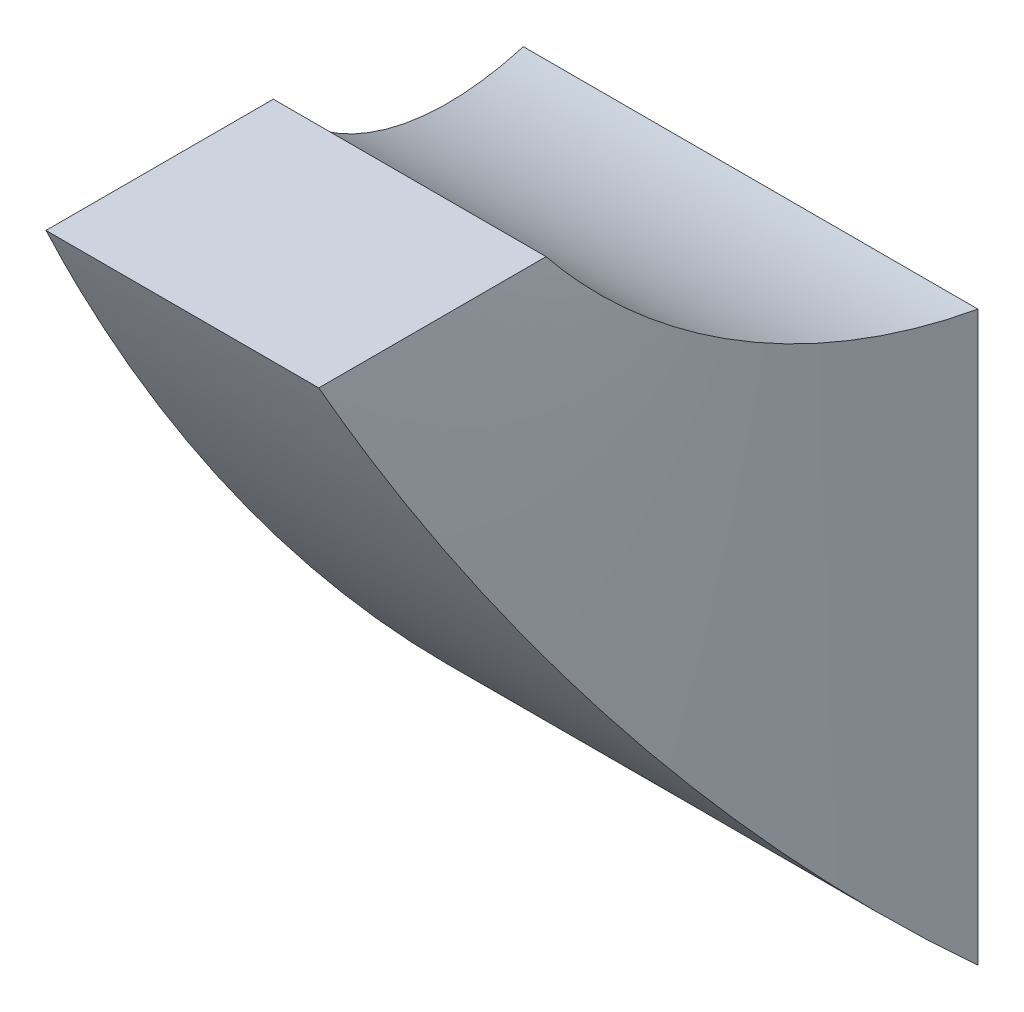
ISO-10303-21;
HEADER;
FILE_DESCRIPTION(('STEP AP214'),'2;1');
FILE_NAME('part.step','',(''),(''),'','','');
FILE_SCHEMA(('AUTOMOTIVE_DESIGN { 1 0 10303 214 1 1 1 1 }'));
ENDSEC;
DATA;
#1=APPLICATION_CONTEXT('core data for automotive mechanical design processes');
#2=APPLICATION_PROTOCOL_DEFINITION('international standard','automotive_design',2000,#1);
#3=PRODUCT_CONTEXT('',#1,'mechanical');
#4=PRODUCT('Part','Part','',(#3));
#5=PRODUCT_RELATED_PRODUCT_CATEGORY('part','',(#4));
#6=PRODUCT_DEFINITION_FORMATION('','',#4);
#7=PRODUCT_DEFINITION_CONTEXT('part definition',#1,'design');
#8=PRODUCT_DEFINITION('design','',#6,#7);
#9=PRODUCT_DEFINITION_SHAPE('','',#8);
#10=(LENGTH_UNIT() NAMED_UNIT(*) SI_UNIT(.MILLI.,.METRE.));
#11=(NAMED_UNIT(*) PLANE_ANGLE_UNIT() SI_UNIT($,.RADIAN.));
#12=(NAMED_UNIT(*) SI_UNIT($,.STERADIAN.) SOLID_ANGLE_UNIT());
#13=UNCERTAINTY_MEASURE_WITH_UNIT(LENGTH_MEASURE(1.E-05),#10,'distance_accuracy_value','');
#14=(GEOMETRIC_REPRESENTATION_CONTEXT(3) GLOBAL_UNCERTAINTY_ASSIGNED_CONTEXT((#13)) GLOBAL_UNIT_ASSIGNED_CONTEXT((#10,
#11,#12)) REPRESENTATION_CONTEXT('',''));
#15=CARTESIAN_POINT('',(0.,0.,0.));
#16=DIRECTION('',(0.,0.,1.));
#17=DIRECTION('',(1.,0.,0.));
#18=AXIS2_PLACEMENT_3D('',#15,#16,#17);
#19=CARTESIAN_POINT('',(0.,400.,0.));
#20=DIRECTION('',(0.,1.,0.));
#21=DIRECTION('',(0.,0.,1.));
#22=AXIS2_PLACEMENT_3D('',#19,#20,#21);
#23=PLANE('',#22);
#24=DIRECTION('',(0.,0.,-1.));
#25=VECTOR('',#24,1.);
#26=CARTESIAN_POINT('',(120.,400.,300.));
#27=LINE('',#26,#25);
#28=CARTESIAN_POINT('',(120.,400.,500.));
#29=VERTEX_POINT('',#28);
#30=CARTESIAN_POINT('',(120.,400.,300.));
#31=VERTEX_POINT('',#30);
#32=EDGE_CURVE('E177',#29,#31,#27,.T.);
#33=ORIENTED_EDGE('',*,*,#32,.T.);
#34=DIRECTION('',(-1.,0.,0.));
#35=VECTOR('',#34,1.);
#36=CARTESIAN_POINT('',(-120.,400.,300.));
#37=LINE('',#36,#35);
#38=CARTESIAN_POINT('',(-120.,400.,300.));
#39=VERTEX_POINT('',#38);
#40=EDGE_CURVE('E13',#31,#39,#37,.T.);
#41=ORIENTED_EDGE('',*,*,#40,.T.);
#42=DIRECTION('',(0.,0.,1.));
#43=VECTOR('',#42,1.);
#44=CARTESIAN_POINT('',(-120.,400.,300.));
#45=LINE('',#44,#43);
#46=CARTESIAN_POINT('',(-120.,400.,500.));
#47=VERTEX_POINT('',#46);
#48=EDGE_CURVE('E132',#39,#47,#45,.T.);
#49=ORIENTED_EDGE('',*,*,#48,.T.);
#50=DIRECTION('',(1.,0.,0.));
#51=VECTOR('',#50,1.);
#52=CARTESIAN_POINT('',(-120.,400.,500.));
#53=LINE('',#52,#51);
#54=EDGE_CURVE('E266',#47,#29,#53,.T.);
#55=ORIENTED_EDGE('',*,*,#54,.T.);
#56=EDGE_LOOP('',(#33,#41,#49,#55));
#57=FACE_BOUND('',#56,.T.);
#58=ADVANCED_FACE('F121',(#57),#23,.T.);
#59=CARTESIAN_POINT('',(0.,0.,0.));
#60=DIRECTION('',(0.,0.,1.));
#61=DIRECTION('',(1.,0.,0.));
#62=AXIS2_PLACEMENT_3D('',#59,#60,#61);
#63=PLANE('',#62);
#64=DIRECTION('',(0.,1.,0.));
#65=VECTOR('',#64,1.);
#66=CARTESIAN_POINT('',(200.,250.,0.));
#67=LINE('',#66,#65);
#68=CARTESIAN_POINT('',(200.,-250.,0.));
#69=VERTEX_POINT('',#68);
#70=CARTESIAN_POINT('',(200.,250.,0.));
#71=VERTEX_POINT('',#70);
#72=EDGE_CURVE('E235',#69,#71,#67,.T.);
#73=ORIENTED_EDGE('',*,*,#72,.F.);
#74=DIRECTION('',(1.,0.,0.));
#75=VECTOR('',#74,1.);
#76=CARTESIAN_POINT('',(-200.,-250.,0.));
#77=LINE('',#76,#75);
#78=CARTESIAN_POINT('',(-200.,-250.,0.));
#79=VERTEX_POINT('',#78);
#80=EDGE_CURVE('E192',#79,#69,#77,.T.);
#81=ORIENTED_EDGE('',*,*,#80,.F.);
#82=DIRECTION('',(0.,-1.,0.));
#83=VECTOR('',#82,1.);
#84=CARTESIAN_POINT('',(-200.,250.,0.));
#85=LINE('',#84,#83);
#86=CARTESIAN_POINT('',(-200.,250.,0.));
#87=VERTEX_POINT('',#86);
#88=EDGE_CURVE('E171',#87,#79,#85,.T.);
#89=ORIENTED_EDGE('',*,*,#88,.F.);
#90=DIRECTION('',(-1.,0.,0.));
#91=VECTOR('',#90,1.);
#92=CARTESIAN_POINT('',(-200.,250.,0.));
#93=LINE('',#92,#91);
#94=EDGE_CURVE('E179',#71,#87,#93,.T.);
#95=ORIENTED_EDGE('',*,*,#94,.F.);
#96=EDGE_LOOP('',(#73,#81,#89,#95));
#97=FACE_BOUND('',#96,.T.);
#98=ADVANCED_FACE('F191',(#97),#63,.F.);
#99=CARTESIAN_POINT('',(200.,250.,0.));
#100=CARTESIAN_POINT('',(173.333333333333,250.,118.022424016757));
#101=CARTESIAN_POINT('',(146.666666666667,305.582060786595,229.186545589946));
#102=CARTESIAN_POINT('',(120.,400.,300.));
#103=CARTESIAN_POINT('',(180.816554809843,250.,0.));
#104=CARTESIAN_POINT('',(157.621178225205,250.,118.022424016757));
#105=CARTESIAN_POINT('',(134.425801640567,305.582060786595,229.186545589946));
#106=CARTESIAN_POINT('',(111.230425055929,400.,300.));
#107=CARTESIAN_POINT('',(145.593946297461,250.,0.));
#108=CARTESIAN_POINT('',(127.972471898226,249.999999999999,118.022424016757));
#109=CARTESIAN_POINT('',(110.350997498992,305.582060786594,229.186545589946));
#110=CARTESIAN_POINT('',(92.729523099757,399.999999999999,300.));
#111=CARTESIAN_POINT('',(96.6037927141635,250.,0.));
#112=CARTESIAN_POINT('',(85.204351703421,250.000000000001,118.022424016757));
#113=CARTESIAN_POINT('',(73.8049106926785,305.582060786595,229.186545589946));
#114=CARTESIAN_POINT('',(62.4054696819361,400.000000000001,300.));
#115=CARTESIAN_POINT('',(48.9456264423833,250.,0.));
#116=CARTESIAN_POINT('',(42.8726100635046,250.,118.022424016757));
#117=CARTESIAN_POINT('',(36.7995936846259,305.582060786594,229.186545589946));
#118=CARTESIAN_POINT('',(30.7265773057472,400.,300.));
#119=CARTESIAN_POINT('',(16.6666666666667,250.,0.));
#120=CARTESIAN_POINT('',(14.4444444444444,250.,118.022424016757));
#121=CARTESIAN_POINT('',(12.2222222222222,305.582060786595,229.186545589946));
#122=CARTESIAN_POINT('',(10.,400.,300.));
#123=CARTESIAN_POINT('',(-16.6666666666667,250.,0.));
#124=CARTESIAN_POINT('',(-14.4444444444444,250.,118.022424016757));
#125=CARTESIAN_POINT('',(-12.2222222222222,305.582060786595,229.186545589946));
#126=CARTESIAN_POINT('',(-9.99999999999999,400.,300.));
#127=CARTESIAN_POINT('',(-48.9456264423832,250.,0.));
#128=CARTESIAN_POINT('',(-42.8726100635046,250.,118.022424016757));
#129=CARTESIAN_POINT('',(-36.7995936846259,305.582060786595,229.186545589946));
#130=CARTESIAN_POINT('',(-30.7265773057472,400.,300.));
#131=CARTESIAN_POINT('',(-96.6037927141633,250.,0.));
#132=CARTESIAN_POINT('',(-85.2043517034208,250.,118.022424016757));
#133=CARTESIAN_POINT('',(-73.8049106926784,305.582060786594,229.186545589946));
#134=CARTESIAN_POINT('',(-62.4054696819359,400.,300.));
#135=CARTESIAN_POINT('',(-145.593946297461,250.,0.));
#136=CARTESIAN_POINT('',(-127.972471898226,250.,118.022424016757));
#137=CARTESIAN_POINT('',(-110.350997498992,305.582060786595,229.186545589946));
#138=CARTESIAN_POINT('',(-92.7295230997569,400.,300.));
#139=CARTESIAN_POINT('',(-180.816554809843,250.,0.));
#140=CARTESIAN_POINT('',(-157.621178225205,250.,118.022424016757));
#141=CARTESIAN_POINT('',(-134.425801640567,305.582060786595,229.186545589946));
#142=CARTESIAN_POINT('',(-111.230425055928,400.,300.));
#143=CARTESIAN_POINT('',(-200.,250.,0.));
#144=CARTESIAN_POINT('',(-173.333333333333,250.,118.022424016757));
#145=CARTESIAN_POINT('',(-146.666666666667,305.582060786595,229.186545589946));
#146=CARTESIAN_POINT('',(-120.,400.,300.));
#147=B_SPLINE_SURFACE_WITH_KNOTS('',3,3,((#99,#100,#101,#102),(#103,#104,#105,#106),(#107,#108,
#109,#110),(#111,#112,#113,#114),(#115,#116,#117,#118),(#119,#120,#121,#122),(#123,#124,#125,
#126),(#127,#128,#129,#130),(#131,#132,#133,#134),(#135,#136,#137,#138),(#139,#140,#141,#142),
(#143,#144,#145,#146)),.UNSPECIFIED.,.F.,.F.,.F.,(4,1,1,1,2,1,1,1,4),(4,4),(0.752525252525253,
0.783459595959596,0.814393939393939,0.845328282828283,0.876262626262626,0.90719696969697,
0.938131313131313,0.969065656565657,1.),(0.,1.),.UNSPECIFIED.);
#148=CARTESIAN_POINT('',(-200.,250.,0.));
#149=CARTESIAN_POINT('',(-173.333333333333,250.,118.022424016757));
#150=CARTESIAN_POINT('',(-146.666666666667,305.582060786595,229.186545589946));
#151=CARTESIAN_POINT('',(-120.,400.,300.));
#152=B_SPLINE_CURVE_WITH_KNOTS('',3,(#148,#149,#150,#151),.UNSPECIFIED.,.F.,.F.,(4,4),(0.,1.),.UNSPECIFIED.);
#153=EDGE_CURVE('E166',#87,#39,#152,.T.);
#154=CARTESIAN_POINT('',(200.,250.,0.));
#155=CARTESIAN_POINT('',(173.333333333333,250.,118.022424016757));
#156=CARTESIAN_POINT('',(146.666666666667,305.582060786595,229.186545589946));
#157=CARTESIAN_POINT('',(120.,400.,300.));
#158=B_SPLINE_CURVE_WITH_KNOTS('',3,(#154,#155,#156,#157),.UNSPECIFIED.,.F.,.F.,(4,4),(0.,1.),.UNSPECIFIED.);
#159=EDGE_CURVE('E140',#71,#31,#158,.T.);
#160=ORIENTED_EDGE('',*,*,#94,.T.);
#161=ORIENTED_EDGE('',*,*,#153,.T.);
#162=ORIENTED_EDGE('',*,*,#40,.F.);
#163=ORIENTED_EDGE('',*,*,#159,.F.);
#164=EDGE_LOOP('',(#160,#161,#162,#163));
#165=FACE_BOUND('',#164,.T.);
#166=ADVANCED_FACE('F181',(#165),#147,.T.);
#167=CARTESIAN_POINT('',(200.,-250.,0.));
#168=CARTESIAN_POINT('',(173.333333333333,-83.3333333333333,184.689090683423));
#169=CARTESIAN_POINT('',(146.666666666667,138.915394119928,362.519878923279));
#170=CARTESIAN_POINT('',(120.,400.,500.));
#171=CARTESIAN_POINT('',(200.,-208.333333333333,0.));
#172=CARTESIAN_POINT('',(173.333333333333,-55.5555555555555,179.133535127868));
#173=CARTESIAN_POINT('',(146.666666666667,152.804283008817,351.408767812168));
#174=CARTESIAN_POINT('',(120.,400.,483.333333333333));
#175=CARTESIAN_POINT('',(200.,-125.,0.));
#176=CARTESIAN_POINT('',(173.333333333334,1.31838984174237E-13,168.022424016757));
#177=CARTESIAN_POINT('',(146.666666666667,180.582060786595,329.186545589946));
#178=CARTESIAN_POINT('',(120.,400.,450.));
#179=CARTESIAN_POINT('',(200.,0.,0.));
#180=CARTESIAN_POINT('',(173.333333333333,83.3333333333332,151.35575735009));
#181=CARTESIAN_POINT('',(146.666666666667,222.248727453261,295.853212256612));
#182=CARTESIAN_POINT('',(120.,400.,400.));
#183=CARTESIAN_POINT('',(200.,125.,0.));
#184=CARTESIAN_POINT('',(173.333333333334,166.666666666667,134.689090683423));
#185=CARTESIAN_POINT('',(146.666666666667,263.915394119928,262.519878923279));
#186=CARTESIAN_POINT('',(120.,400.,350.));
#187=CARTESIAN_POINT('',(200.,208.333333333333,0.));
#188=CARTESIAN_POINT('',(173.333333333333,222.222222222222,123.577979572312));
#189=CARTESIAN_POINT('',(146.666666666667,291.693171897706,240.297656701057));
#190=CARTESIAN_POINT('',(120.,400.,316.666666666667));
#191=CARTESIAN_POINT('',(200.,250.,0.));
#192=CARTESIAN_POINT('',(173.333333333333,250.,118.022424016757));
#193=CARTESIAN_POINT('',(146.666666666667,305.582060786595,229.186545589946));
#194=CARTESIAN_POINT('',(120.,400.,300.));
#195=B_SPLINE_SURFACE_WITH_KNOTS('',3,3,((#167,#168,#169,#170),(#171,#172,#173,#174),(#175,#176,
#177,#178),(#179,#180,#181,#182),(#183,#184,#185,#186),(#187,#188,#189,#190),(#191,#192,#193,
#194)),.UNSPECIFIED.,.F.,.F.,.F.,(4,1,1,1,4),(4,4),(0.5,0.563131313131313,0.626262626262626,
0.689393939393939,0.752525252525253),(0.,1.),.UNSPECIFIED.);
#196=CARTESIAN_POINT('',(200.,-250.,0.));
#197=CARTESIAN_POINT('',(173.333333333333,-83.3333333333333,184.689090683423));
#198=CARTESIAN_POINT('',(146.666666666667,138.915394119928,362.519878923279));
#199=CARTESIAN_POINT('',(120.,400.,500.));
#200=B_SPLINE_CURVE_WITH_KNOTS('',3,(#196,#197,#198,#199),.UNSPECIFIED.,.F.,.F.,(4,4),(0.,1.),.UNSPECIFIED.);
#201=EDGE_CURVE('E278',#69,#29,#200,.T.);
#202=ORIENTED_EDGE('',*,*,#72,.T.);
#203=ORIENTED_EDGE('',*,*,#159,.T.);
#204=ORIENTED_EDGE('',*,*,#32,.F.);
#205=ORIENTED_EDGE('',*,*,#201,.F.);
#206=EDGE_LOOP('',(#202,#203,#204,#205));
#207=FACE_BOUND('',#206,.T.);
#208=ADVANCED_FACE('F286',(#207),#195,.T.);
#209=CARTESIAN_POINT('',(-200.,-250.,0.));
#210=CARTESIAN_POINT('',(-173.333333333333,-83.3333333333333,184.689090683423));
#211=CARTESIAN_POINT('',(-146.666666666667,138.915394119928,362.519878923279));
#212=CARTESIAN_POINT('',(-120.,400.,500.));
#213=CARTESIAN_POINT('',(-166.666666666667,-250.,0.));
#214=CARTESIAN_POINT('',(-144.444444444444,-83.3333333333333,184.689090683423));
#215=CARTESIAN_POINT('',(-122.222222222222,138.915394119928,362.519878923279));
#216=CARTESIAN_POINT('',(-99.9999999999998,400.,500.));
#217=CARTESIAN_POINT('',(-99.9999999999999,-250.,0.));
#218=CARTESIAN_POINT('',(-86.6666666666666,-83.3333333333334,184.689090683423));
#219=CARTESIAN_POINT('',(-73.3333333333332,138.915394119928,362.51987892328));
#220=CARTESIAN_POINT('',(-59.9999999999998,400.,500.));
#221=CARTESIAN_POINT('',(0.,-250.,0.));
#222=CARTESIAN_POINT('',(0.,-83.3333333333333,184.689090683423));
#223=CARTESIAN_POINT('',(1.02926926241291E-13,138.915394119928,362.519878923279));
#224=CARTESIAN_POINT('',(1.59594559789866E-13,400.,500.));
#225=CARTESIAN_POINT('',(100.,-250.,0.));
#226=CARTESIAN_POINT('',(86.6666666666668,-83.3333333333334,184.689090683423));
#227=CARTESIAN_POINT('',(73.3333333333335,138.915394119928,362.519878923279));
#228=CARTESIAN_POINT('',(60.0000000000002,400.,500.));
#229=CARTESIAN_POINT('',(166.666666666667,-250.,0.));
#230=CARTESIAN_POINT('',(144.444444444445,-83.3333333333333,184.689090683423));
#231=CARTESIAN_POINT('',(122.222222222222,138.915394119928,362.519878923279));
#232=CARTESIAN_POINT('',(100.,400.,500.));
#233=CARTESIAN_POINT('',(200.,-250.,0.));
#234=CARTESIAN_POINT('',(173.333333333333,-83.3333333333333,184.689090683423));
#235=CARTESIAN_POINT('',(146.666666666667,138.915394119928,362.519878923279));
#236=CARTESIAN_POINT('',(120.,400.,500.));
#237=B_SPLINE_SURFACE_WITH_KNOTS('',3,3,((#209,#210,#211,#212),(#213,#214,#215,#216),(#217,#218,
#219,#220),(#221,#222,#223,#224),(#225,#226,#227,#228),(#229,#230,#231,#232),(#233,#234,#235,
#236)),.UNSPECIFIED.,.F.,.F.,.F.,(4,1,1,1,4),(4,4),(0.252525252525253,0.314393939393939,
0.376262626262626,0.438131313131313,0.5),(0.,1.),.UNSPECIFIED.);
#238=CARTESIAN_POINT('',(-200.,-250.,0.));
#239=CARTESIAN_POINT('',(-173.333333333333,-83.3333333333333,184.689090683423));
#240=CARTESIAN_POINT('',(-146.666666666667,138.915394119928,362.519878923279));
#241=CARTESIAN_POINT('',(-120.,400.,500.));
#242=B_SPLINE_CURVE_WITH_KNOTS('',3,(#238,#239,#240,#241),.UNSPECIFIED.,.F.,.F.,(4,4),(0.,1.),.UNSPECIFIED.);
#243=EDGE_CURVE('E186',#79,#47,#242,.T.);
#244=ORIENTED_EDGE('',*,*,#80,.T.);
#245=ORIENTED_EDGE('',*,*,#201,.T.);
#246=ORIENTED_EDGE('',*,*,#54,.F.);
#247=ORIENTED_EDGE('',*,*,#243,.F.);
#248=EDGE_LOOP('',(#244,#245,#246,#247));
#249=FACE_BOUND('',#248,.T.);
#250=ADVANCED_FACE('F306',(#249),#237,.T.);
#251=CARTESIAN_POINT('',(-200.,250.,0.));
#252=CARTESIAN_POINT('',(-173.333333333333,250.,118.022424016757));
#253=CARTESIAN_POINT('',(-146.666666666667,305.582060786595,229.186545589946));
#254=CARTESIAN_POINT('',(-120.,400.,300.));
#255=CARTESIAN_POINT('',(-200.,208.333333333333,0.));
#256=CARTESIAN_POINT('',(-173.333333333333,222.222222222222,123.577979572312));
#257=CARTESIAN_POINT('',(-146.666666666667,291.693171897706,240.297656701057));
#258=CARTESIAN_POINT('',(-120.,400.,316.666666666667));
#259=CARTESIAN_POINT('',(-200.,125.,0.));
#260=CARTESIAN_POINT('',(-173.333333333333,166.666666666666,134.689090683423));
#261=CARTESIAN_POINT('',(-146.666666666667,263.915394119928,262.519878923279));
#262=CARTESIAN_POINT('',(-120.,400.,350.));
#263=CARTESIAN_POINT('',(-200.,0.,0.));
#264=CARTESIAN_POINT('',(-173.333333333333,83.3333333333335,151.35575735009));
#265=CARTESIAN_POINT('',(-146.666666666667,222.248727453261,295.853212256613));
#266=CARTESIAN_POINT('',(-120.,400.,400.));
#267=CARTESIAN_POINT('',(-200.,-125.,0.));
#268=CARTESIAN_POINT('',(-173.333333333333,-1.04083408558608E-13,168.022424016757));
#269=CARTESIAN_POINT('',(-146.666666666667,180.582060786594,329.186545589946));
#270=CARTESIAN_POINT('',(-120.,400.,450.));
#271=CARTESIAN_POINT('',(-200.,-208.333333333333,0.));
#272=CARTESIAN_POINT('',(-173.333333333333,-55.5555555555555,179.133535127868));
#273=CARTESIAN_POINT('',(-146.666666666667,152.804283008817,351.408767812168));
#274=CARTESIAN_POINT('',(-120.,400.,483.333333333333));
#275=CARTESIAN_POINT('',(-200.,-250.,0.));
#276=CARTESIAN_POINT('',(-173.333333333333,-83.3333333333333,184.689090683423));
#277=CARTESIAN_POINT('',(-146.666666666667,138.915394119928,362.519878923279));
#278=CARTESIAN_POINT('',(-120.,400.,500.));
#279=B_SPLINE_SURFACE_WITH_KNOTS('',3,3,((#251,#252,#253,#254),(#255,#256,#257,#258),(#259,#260,
#261,#262),(#263,#264,#265,#266),(#267,#268,#269,#270),(#271,#272,#273,#274),(#275,#276,#277,
#278)),.UNSPECIFIED.,.F.,.F.,.F.,(4,1,1,1,4),(4,4),(0.,0.0631313131313131,0.126262626262626,
0.189393939393939,0.252525252525253),(0.,1.),.UNSPECIFIED.);
#280=ORIENTED_EDGE('',*,*,#88,.T.);
#281=ORIENTED_EDGE('',*,*,#243,.T.);
#282=ORIENTED_EDGE('',*,*,#48,.F.);
#283=ORIENTED_EDGE('',*,*,#153,.F.);
#284=EDGE_LOOP('',(#280,#281,#282,#283));
#285=FACE_BOUND('',#284,.T.);
#286=ADVANCED_FACE('F168',(#285),#279,.T.);
#287=CLOSED_SHELL('',(#58,#98,#166,#208,#250,#286));
#288=MANIFOLD_SOLID_BREP('B2',#287);
#289=ADVANCED_BREP_SHAPE_REPRESENTATION('',(#18,#288),#14);
#290=SHAPE_DEFINITION_REPRESENTATION(#9,#289);
ENDSEC;
END-ISO-10303-21;
